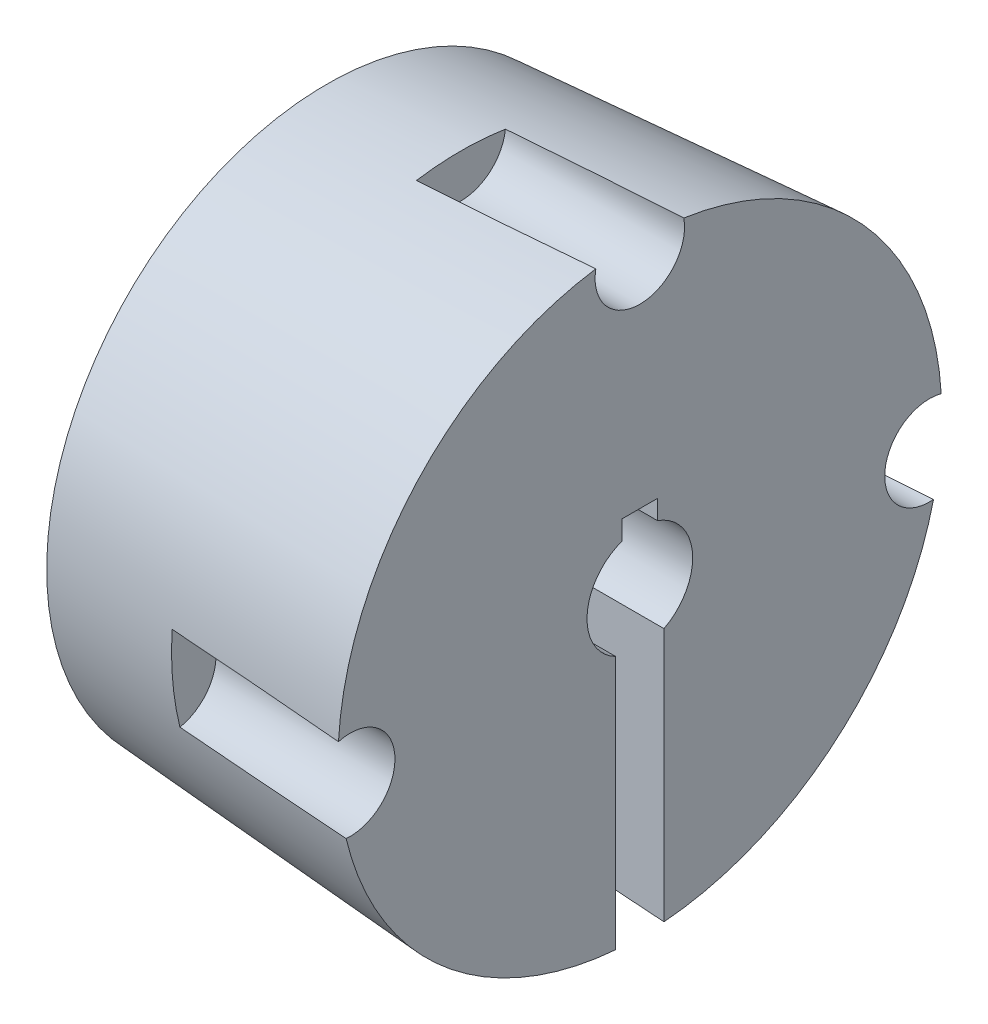
ISO-10303-21;
HEADER;
FILE_DESCRIPTION(('STEP AP214'),'2;1');
FILE_NAME('part.step','',(''),(''),'','','');
FILE_SCHEMA(('AUTOMOTIVE_DESIGN { 1 0 10303 214 1 1 1 1 }'));
ENDSEC;
DATA;
#1=APPLICATION_CONTEXT('core data for automotive mechanical design processes');
#2=APPLICATION_PROTOCOL_DEFINITION('international standard','automotive_design',2000,#1);
#3=PRODUCT_CONTEXT('',#1,'mechanical');
#4=PRODUCT('Part','Part','',(#3));
#5=PRODUCT_RELATED_PRODUCT_CATEGORY('part','',(#4));
#6=PRODUCT_DEFINITION_FORMATION('','',#4);
#7=PRODUCT_DEFINITION_CONTEXT('part definition',#1,'design');
#8=PRODUCT_DEFINITION('design','',#6,#7);
#9=PRODUCT_DEFINITION_SHAPE('','',#8);
#10=(LENGTH_UNIT() NAMED_UNIT(*) SI_UNIT(.MILLI.,.METRE.));
#11=(NAMED_UNIT(*) PLANE_ANGLE_UNIT() SI_UNIT($,.RADIAN.));
#12=(NAMED_UNIT(*) SI_UNIT($,.STERADIAN.) SOLID_ANGLE_UNIT());
#13=UNCERTAINTY_MEASURE_WITH_UNIT(LENGTH_MEASURE(1.E-05),#10,'distance_accuracy_value','');
#14=(GEOMETRIC_REPRESENTATION_CONTEXT(3) GLOBAL_UNCERTAINTY_ASSIGNED_CONTEXT((#13)) GLOBAL_UNIT_ASSIGNED_CONTEXT((#10,
#11,#12)) REPRESENTATION_CONTEXT('',''));
#15=CARTESIAN_POINT('',(0.,0.,0.));
#16=DIRECTION('',(0.,0.,1.));
#17=DIRECTION('',(1.,0.,0.));
#18=AXIS2_PLACEMENT_3D('',#15,#16,#17);
#19=CARTESIAN_POINT('',(44.45,21.43125,0.));
#20=DIRECTION('',(1.,0.,0.));
#21=DIRECTION('',(0.,-1.,0.));
#22=AXIS2_PLACEMENT_3D('',#19,#20,#21);
#23=PLANE('',#22);
#24=DIRECTION('',(0.,1.,0.));
#25=VECTOR('',#24,1.);
#26=CARTESIAN_POINT('',(44.45,-2.143125,3.429));
#27=LINE('',#26,#25);
#28=CARTESIAN_POINT('',(44.45,-42.7251198389191,3.429));
#29=VERTEX_POINT('',#28);
#30=CARTESIAN_POINT('',(44.45,-6.67022930640319,3.429));
#31=VERTEX_POINT('',#30);
#32=EDGE_CURVE('E145',#29,#31,#27,.T.);
#33=ORIENTED_EDGE('',*,*,#32,.T.);
#34=CARTESIAN_POINT('',(44.45,0.,0.));
#35=DIRECTION('',(-1.,0.,0.));
#36=DIRECTION('',(0.,0.,-1.));
#37=AXIS2_PLACEMENT_3D('',#34,#35,#36);
#38=CIRCLE('',#37,7.5);
#39=CARTESIAN_POINT('',(44.45,7.07106781186548,2.5));
#40=VERTEX_POINT('',#39);
#41=EDGE_CURVE('E171',#31,#40,#38,.T.);
#42=ORIENTED_EDGE('',*,*,#41,.T.);
#43=DIRECTION('',(0.,1.,0.));
#44=VECTOR('',#43,1.);
#45=CARTESIAN_POINT('',(44.45,13.165625,2.5));
#46=LINE('',#45,#44);
#47=CARTESIAN_POINT('',(44.45,9.8,2.5));
#48=VERTEX_POINT('',#47);
#49=EDGE_CURVE('E168',#40,#48,#46,.T.);
#50=ORIENTED_EDGE('',*,*,#49,.T.);
#51=DIRECTION('',(0.,0.,-1.));
#52=VECTOR('',#51,1.);
#53=CARTESIAN_POINT('',(44.45,9.8,0.));
#54=LINE('',#53,#52);
#55=CARTESIAN_POINT('',(44.45,9.8,-2.5));
#56=VERTEX_POINT('',#55);
#57=EDGE_CURVE('E11',#48,#56,#54,.T.);
#58=ORIENTED_EDGE('',*,*,#57,.T.);
#59=DIRECTION('',(0.,-1.,0.));
#60=VECTOR('',#59,1.);
#61=CARTESIAN_POINT('',(44.45,13.165625,-2.5));
#62=LINE('',#61,#60);
#63=CARTESIAN_POINT('',(44.45,7.07106781186548,-2.5));
#64=VERTEX_POINT('',#63);
#65=EDGE_CURVE('E166',#56,#64,#62,.T.);
#66=ORIENTED_EDGE('',*,*,#65,.T.);
#67=CARTESIAN_POINT('',(44.45,0.,0.));
#68=DIRECTION('',(-1.,0.,0.));
#69=DIRECTION('',(0.,0.,-1.));
#70=AXIS2_PLACEMENT_3D('',#67,#68,#69);
#71=CIRCLE('',#70,7.5);
#72=CARTESIAN_POINT('',(44.45,-6.67022930640319,-3.429));
#73=VERTEX_POINT('',#72);
#74=EDGE_CURVE('E135',#64,#73,#71,.T.);
#75=ORIENTED_EDGE('',*,*,#74,.T.);
#76=DIRECTION('',(0.,-1.,0.));
#77=VECTOR('',#76,1.);
#78=CARTESIAN_POINT('',(44.45,-2.143125,-3.429));
#79=LINE('',#78,#77);
#80=CARTESIAN_POINT('',(44.45,-42.7251198389191,-3.429));
#81=VERTEX_POINT('',#80);
#82=EDGE_CURVE('E132',#73,#81,#79,.T.);
#83=ORIENTED_EDGE('',*,*,#82,.T.);
#84=CARTESIAN_POINT('',(44.45,0.,0.));
#85=DIRECTION('',(-1.,0.,0.));
#86=DIRECTION('',(0.,1.,0.));
#87=AXIS2_PLACEMENT_3D('',#84,#85,#86);
#88=CIRCLE('',#87,42.8625);
#89=CARTESIAN_POINT('',(44.45,-9.92074935625879,-41.6985927635489));
#90=VERTEX_POINT('',#89);
#91=EDGE_CURVE('E117',#90,#81,#88,.T.);
#92=ORIENTED_EDGE('',*,*,#91,.F.);
#93=CARTESIAN_POINT('',(44.45,-3.59735328190959,-41.1179361637368));
#94=DIRECTION('',(-1.,0.,0.));
#95=DIRECTION('',(0.,-0.996194698091746,0.0871557427476582));
#96=AXIS2_PLACEMENT_3D('',#93,#94,#95);
#97=CIRCLE('',#96,6.35);
#98=CARTESIAN_POINT('',(44.45,2.52914623706881,-42.7878174900464));
#99=VERTEX_POINT('',#98);
#100=EDGE_CURVE('E220',#90,#99,#97,.T.);
#101=ORIENTED_EDGE('',*,*,#100,.T.);
#102=CARTESIAN_POINT('',(44.45,0.,0.));
#103=DIRECTION('',(-1.,0.,0.));
#104=DIRECTION('',(0.,1.,0.));
#105=AXIS2_PLACEMENT_3D('',#102,#103,#104);
#106=CIRCLE('',#105,42.8625);
#107=CARTESIAN_POINT('',(44.45,42.4045673076923,-6.24872608596287));
#108=VERTEX_POINT('',#107);
#109=EDGE_CURVE('E129',#108,#99,#106,.T.);
#110=ORIENTED_EDGE('',*,*,#109,.F.);
#111=CARTESIAN_POINT('',(44.45,41.275,0.));
#112=DIRECTION('',(-1.,0.,0.));
#113=DIRECTION('',(0.,0.,-1.));
#114=AXIS2_PLACEMENT_3D('',#111,#112,#113);
#115=CIRCLE('',#114,6.35);
#116=CARTESIAN_POINT('',(44.45,42.4045673076923,6.24872608596287));
#117=VERTEX_POINT('',#116);
#118=EDGE_CURVE('E175',#108,#117,#115,.T.);
#119=ORIENTED_EDGE('',*,*,#118,.T.);
#120=CARTESIAN_POINT('',(44.45,0.,0.));
#121=DIRECTION('',(-1.,0.,0.));
#122=DIRECTION('',(0.,1.,0.));
#123=AXIS2_PLACEMENT_3D('',#120,#121,#122);
#124=CIRCLE('',#123,42.8625);
#125=CARTESIAN_POINT('',(44.45,2.52914623706881,42.7878174900464));
#126=VERTEX_POINT('',#125);
#127=EDGE_CURVE('E181',#126,#117,#124,.T.);
#128=ORIENTED_EDGE('',*,*,#127,.F.);
#129=CARTESIAN_POINT('',(44.45,-3.59735328190959,41.1179361637368));
#130=DIRECTION('',(-1.,0.,0.));
#131=DIRECTION('',(0.,0.996194698091746,0.0871557427476582));
#132=AXIS2_PLACEMENT_3D('',#129,#130,#131);
#133=CIRCLE('',#132,6.35);
#134=CARTESIAN_POINT('',(44.45,-9.92074935625879,41.6985927635489));
#135=VERTEX_POINT('',#134);
#136=EDGE_CURVE('E193',#126,#135,#133,.T.);
#137=ORIENTED_EDGE('',*,*,#136,.T.);
#138=CARTESIAN_POINT('',(44.45,0.,0.));
#139=DIRECTION('',(-1.,0.,0.));
#140=DIRECTION('',(0.,1.,0.));
#141=AXIS2_PLACEMENT_3D('',#138,#139,#140);
#142=CIRCLE('',#141,42.8625);
#143=EDGE_CURVE('E204',#29,#135,#142,.T.);
#144=ORIENTED_EDGE('',*,*,#143,.F.);
#145=EDGE_LOOP('',(#33,#42,#50,#58,#66,#75,#83,#92,#101,#110,#119,#128,#137,#144));
#146=FACE_BOUND('',#145,.T.);
#147=ADVANCED_FACE('F19',(#146),#23,.T.);
#148=CARTESIAN_POINT('',(22.225,9.8,0.));
#149=DIRECTION('',(0.,-1.,0.));
#150=DIRECTION('',(0.,0.,-1.));
#151=AXIS2_PLACEMENT_3D('',#148,#149,#150);
#152=PLANE('',#151);
#153=DIRECTION('',(0.,0.,1.));
#154=VECTOR('',#153,1.);
#155=CARTESIAN_POINT('',(0.,9.8,0.));
#156=LINE('',#155,#154);
#157=CARTESIAN_POINT('',(0.,9.8,-2.5));
#158=VERTEX_POINT('',#157);
#159=CARTESIAN_POINT('',(0.,9.8,2.5));
#160=VERTEX_POINT('',#159);
#161=EDGE_CURVE('E164',#158,#160,#156,.T.);
#162=ORIENTED_EDGE('',*,*,#161,.F.);
#163=DIRECTION('',(1.,0.,0.));
#164=VECTOR('',#163,1.);
#165=CARTESIAN_POINT('',(22.225,9.8,-2.5));
#166=LINE('',#165,#164);
#167=EDGE_CURVE('E31',#158,#56,#166,.T.);
#168=ORIENTED_EDGE('',*,*,#167,.T.);
#169=ORIENTED_EDGE('',*,*,#57,.F.);
#170=DIRECTION('',(-1.,0.,0.));
#171=VECTOR('',#170,1.);
#172=CARTESIAN_POINT('',(22.225,9.8,2.5));
#173=LINE('',#172,#171);
#174=EDGE_CURVE('E177',#48,#160,#173,.T.);
#175=ORIENTED_EDGE('',*,*,#174,.T.);
#176=EDGE_LOOP('',(#162,#168,#169,#175));
#177=FACE_BOUND('',#176,.T.);
#178=ADVANCED_FACE('F311',(#177),#152,.T.);
#179=CARTESIAN_POINT('',(22.225,4.9,-2.5));
#180=DIRECTION('',(0.,0.,1.));
#181=DIRECTION('',(1.,0.,0.));
#182=AXIS2_PLACEMENT_3D('',#179,#180,#181);
#183=PLANE('',#182);
#184=DIRECTION('',(0.,1.,0.));
#185=VECTOR('',#184,1.);
#186=CARTESIAN_POINT('',(0.,12.3898261474885,-2.5));
#187=LINE('',#186,#185);
#188=CARTESIAN_POINT('',(0.,7.07106781186548,-2.5));
#189=VERTEX_POINT('',#188);
#190=EDGE_CURVE('E174',#189,#158,#187,.T.);
#191=ORIENTED_EDGE('',*,*,#190,.F.);
#192=DIRECTION('',(-1.,0.,0.));
#193=VECTOR('',#192,1.);
#194=CARTESIAN_POINT('',(22.225,7.07106781186548,-2.5));
#195=LINE('',#194,#193);
#196=EDGE_CURVE('E155',#64,#189,#195,.T.);
#197=ORIENTED_EDGE('',*,*,#196,.F.);
#198=ORIENTED_EDGE('',*,*,#65,.F.);
#199=ORIENTED_EDGE('',*,*,#167,.F.);
#200=EDGE_LOOP('',(#191,#197,#198,#199));
#201=FACE_BOUND('',#200,.T.);
#202=ADVANCED_FACE('F309',(#201),#183,.T.);
#203=CARTESIAN_POINT('',(22.225,4.9,2.5));
#204=DIRECTION('',(0.,0.,1.));
#205=DIRECTION('',(1.,0.,0.));
#206=AXIS2_PLACEMENT_3D('',#203,#204,#205);
#207=PLANE('',#206);
#208=DIRECTION('',(0.,-1.,0.));
#209=VECTOR('',#208,1.);
#210=CARTESIAN_POINT('',(0.,12.3898261474885,2.5));
#211=LINE('',#210,#209);
#212=CARTESIAN_POINT('',(0.,7.07106781186548,2.5));
#213=VERTEX_POINT('',#212);
#214=EDGE_CURVE('E161',#160,#213,#211,.T.);
#215=ORIENTED_EDGE('',*,*,#214,.F.);
#216=ORIENTED_EDGE('',*,*,#174,.F.);
#217=ORIENTED_EDGE('',*,*,#49,.F.);
#218=DIRECTION('',(1.,0.,0.));
#219=VECTOR('',#218,1.);
#220=CARTESIAN_POINT('',(22.225,7.07106781186548,2.5));
#221=LINE('',#220,#219);
#222=EDGE_CURVE('E160',#213,#40,#221,.T.);
#223=ORIENTED_EDGE('',*,*,#222,.F.);
#224=EDGE_LOOP('',(#215,#216,#217,#223));
#225=FACE_BOUND('',#224,.T.);
#226=ADVANCED_FACE('F306',(#225),#207,.F.);
#227=CARTESIAN_POINT('',(32.25,41.275,0.));
#228=DIRECTION('',(-1.,0.,0.));
#229=DIRECTION('',(0.,0.,-1.));
#230=AXIS2_PLACEMENT_3D('',#227,#228,#229);
#231=CYLINDRICAL_SURFACE('',#230,6.35);
#232=CARTESIAN_POINT('',(44.4499994377605,42.4045707751449,6.24870228614474));
#233=CARTESIAN_POINT('',(43.3968772363578,42.3282276338168,6.26245814853408));
#234=CARTESIAN_POINT('',(42.3437226003836,42.2520739228383,6.27477039432463));
#235=CARTESIAN_POINT('',(40.2359334055662,42.1000478170982,6.29657493333557));
#236=CARTESIAN_POINT('',(39.1812987696076,42.0241759414053,6.30606339424084));
#237=CARTESIAN_POINT('',(37.0705496273191,41.87271962596,6.32226173233247));
#238=CARTESIAN_POINT('',(36.0144350540272,41.7971357156746,6.32896782320019));
#239=CARTESIAN_POINT('',(33.9007260094879,41.6462593299077,6.33964257163051));
#240=CARTESIAN_POINT('',(32.843131481084,41.5709673913316,6.34360748970003));
#241=CARTESIAN_POINT('',(30.7264625218382,41.4206774719164,6.34884096730903));
#242=CARTESIAN_POINT('',(29.6673880434314,41.3456800333124,6.35010583515522));
#243=CARTESIAN_POINT('',(27.5477591689462,41.1959800023421,6.34998015915306));
#244=CARTESIAN_POINT('',(26.4872047346296,41.1212779551954,6.34858597226661));
#245=CARTESIAN_POINT('',(24.3646159544568,40.9721681737217,6.34318305670457));
#246=CARTESIAN_POINT('',(23.3025815794635,40.8977609855277,6.33917073452475));
#247=CARTESIAN_POINT('',(21.1770328507258,40.7492384984032,6.3285721833212));
#248=CARTESIAN_POINT('',(20.1135184765855,40.6751237437879,6.32198241094245));
#249=CARTESIAN_POINT('',(19.0499999356797,40.6012048561771,6.31413160864357));
#250=B_SPLINE_CURVE_WITH_KNOTS('',3,(#232,#233,#234,#235,#236,#237,#238,#239,#240,#241,#242,
#243,#244,#245,#246,#247,#248,#249),.UNSPECIFIED.,.F.,.F.,(4,2,2,2,2,2,2,2,4),(0.,
3.16792472189612,6.34012940656053,9.51663685904563,12.6974691802353,15.8826477746161,
19.0721933580867,22.2661259658029,25.4644649600553),.UNSPECIFIED.);
#251=CARTESIAN_POINT('',(19.05,40.6012019274809,6.31415046997373));
#252=VERTEX_POINT('',#251);
#253=EDGE_CURVE('E184',#117,#252,#250,.T.);
#254=ORIENTED_EDGE('',*,*,#253,.F.);
#255=ORIENTED_EDGE('',*,*,#118,.F.);
#256=CARTESIAN_POINT('',(19.0499999356797,40.6012048561771,-6.31413160864345));
#257=CARTESIAN_POINT('',(20.1135184765855,40.6751237437879,-6.32198241094234));
#258=CARTESIAN_POINT('',(21.1770328507259,40.7492384984033,-6.32857218332111));
#259=CARTESIAN_POINT('',(23.3025815794636,40.8977609855277,-6.33917073452468));
#260=CARTESIAN_POINT('',(24.3646159544569,40.9721681737217,-6.34318305670451));
#261=CARTESIAN_POINT('',(26.4872047346297,41.1212779551954,-6.34858597226657));
#262=CARTESIAN_POINT('',(27.5477591689464,41.1959800023421,-6.34998015915304));
#263=CARTESIAN_POINT('',(29.6673880434315,41.3456800333125,-6.3501058351552));
#264=CARTESIAN_POINT('',(30.7264625218384,41.4206774719165,-6.34884096730901));
#265=CARTESIAN_POINT('',(32.8431314810842,41.5709673913316,-6.34360748970002));
#266=CARTESIAN_POINT('',(33.9007260094881,41.6462593299077,-6.33964257163052));
#267=CARTESIAN_POINT('',(36.0144350540273,41.7971357156746,-6.3289678232002));
#268=CARTESIAN_POINT('',(37.0705496273192,41.87271962596,-6.32226173233247));
#269=CARTESIAN_POINT('',(39.1812987696077,42.0241759414053,-6.30606339424085));
#270=CARTESIAN_POINT('',(40.2359334055663,42.1000478170982,-6.2965749333356));
#271=CARTESIAN_POINT('',(42.3437226003836,42.2520739228383,-6.27477039432468));
#272=CARTESIAN_POINT('',(43.3968772363578,42.3282276338168,-6.26245814853414));
#273=CARTESIAN_POINT('',(44.4499994377605,42.4045707751449,-6.24870228614477));
#274=B_SPLINE_CURVE_WITH_KNOTS('',3,(#256,#257,#258,#259,#260,#261,#262,#263,#264,#265,#266,
#267,#268,#269,#270,#271,#272,#273),.UNSPECIFIED.,.F.,.F.,(4,2,2,2,2,2,2,2,4),(0.,
3.19833899425247,6.39227160196867,9.58181718543935,12.7669957798202,15.9478281010098,
19.1243355534949,22.2965402381592,25.4644649600553),.UNSPECIFIED.);
#275=CARTESIAN_POINT('',(19.05,40.6012019274809,-6.31415046997373));
#276=VERTEX_POINT('',#275);
#277=EDGE_CURVE('E189',#276,#108,#274,.T.);
#278=ORIENTED_EDGE('',*,*,#277,.F.);
#279=CARTESIAN_POINT('',(19.05,41.275,0.));
#280=DIRECTION('',(-1.,0.,0.));
#281=DIRECTION('',(0.,0.,-1.));
#282=AXIS2_PLACEMENT_3D('',#279,#280,#281);
#283=CIRCLE('',#282,6.35);
#284=EDGE_CURVE('E178',#276,#252,#283,.T.);
#285=ORIENTED_EDGE('',*,*,#284,.T.);
#286=EDGE_LOOP('',(#254,#255,#278,#285));
#287=FACE_BOUND('',#286,.T.);
#288=ADVANCED_FACE('F308',(#287),#231,.F.);
#289=CARTESIAN_POINT('',(19.05,41.275,0.));
#290=DIRECTION('',(-1.,0.,0.));
#291=DIRECTION('',(0.,0.,1.));
#292=AXIS2_PLACEMENT_3D('',#289,#290,#291);
#293=PLANE('',#292);
#294=CARTESIAN_POINT('',(19.05,0.,0.));
#295=DIRECTION('',(-1.,0.,0.));
#296=DIRECTION('',(0.,1.,0.));
#297=AXIS2_PLACEMENT_3D('',#294,#295,#296);
#298=CIRCLE('',#297,41.0892454799738);
#299=EDGE_CURVE('E196',#252,#276,#298,.T.);
#300=ORIENTED_EDGE('',*,*,#299,.F.);
#301=ORIENTED_EDGE('',*,*,#284,.F.);
#302=EDGE_LOOP('',(#300,#301));
#303=FACE_BOUND('',#302,.T.);
#304=ADVANCED_FACE('F245',(#303),#293,.F.);
#305=CARTESIAN_POINT('',(32.25,-3.59735328190959,41.1179361637368));
#306=DIRECTION('',(-1.,0.,0.));
#307=DIRECTION('',(0.,0.996194698091746,0.0871557427476582));
#308=AXIS2_PLACEMENT_3D('',#305,#306,#307);
#309=CYLINDRICAL_SURFACE('',#308,6.35);
#310=CARTESIAN_POINT('',(44.4499994373455,-9.92072593192531,41.6985982961812));
#311=CARTESIAN_POINT('',(43.396876577148,-9.92777569717745,41.621346715967));
#312=CARTESIAN_POINT('',(42.3437212824389,-9.93340385104634,41.5444096642893));
#313=CARTESIAN_POINT('',(40.235930958359,-9.94187545690467,41.3910615948311));
#314=CARTESIAN_POINT('',(39.1812958518832,-9.94471513690661,41.3146514280387));
#315=CARTESIAN_POINT('',(37.0705459567665,-9.94765153991716,41.1623596192388));
#316=CARTESIAN_POINT('',(36.0144311011725,-9.94774453765601,41.0864788345693));
#317=CARTESIAN_POINT('',(33.9007216802376,-9.94522891857416,40.9352461871537));
#318=CARTESIAN_POINT('',(32.8431270577475,-9.94261662376948,40.8598951850747));
#319=CARTESIAN_POINT('',(30.726458098539,-9.93473155802947,40.7097210362591));
#320=CARTESIAN_POINT('',(29.6673837142618,-9.92945515718274,40.6348987513336));
#321=CARTESIAN_POINT('',(27.5477552162469,-9.91628274787218,40.485779353183));
#322=CARTESIAN_POINT('',(26.4872010642758,-9.90838315821735,40.4114831005028));
#323=CARTESIAN_POINT('',(24.364613037006,-9.89000503922054,40.2634116734014));
#324=CARTESIAN_POINT('',(23.3025791325738,-9.87952297810284,40.1896373561188));
#325=CARTESIAN_POINT('',(21.1770315331732,-9.856020185306,40.0426038439033));
#326=CARTESIAN_POINT('',(20.1135178178115,-9.8429959716415,39.9693454999289));
#327=CARTESIAN_POINT('',(19.0499999356798,-9.8287325972978,39.8963921836968));
#328=B_SPLINE_CURVE_WITH_KNOTS('',3,(#310,#311,#312,#313,#314,#315,#316,#317,#318,#319,#320,
#321,#322,#323,#324,#325,#326,#327),.UNSPECIFIED.,.F.,.F.,(4,2,2,2,2,2,2,2,4),(0.,
3.16792670269164,6.34013280225914,9.51664110370384,12.6974737078695,15.8826520192134,
19.0721967536152,22.2661279462216,25.4644649593242),.UNSPECIFIED.);
#329=CARTESIAN_POINT('',(19.05,-9.82875113157858,39.8963876222778));
#330=VERTEX_POINT('',#329);
#331=EDGE_CURVE('E207',#135,#330,#328,.T.);
#332=ORIENTED_EDGE('',*,*,#331,.F.);
#333=ORIENTED_EDGE('',*,*,#136,.F.);
#334=CARTESIAN_POINT('',(19.0499999356798,2.75147626591841,40.9970178440166));
#335=CARTESIAN_POINT('',(20.1135178178116,2.75285473713774,41.0713396444121));
#336=CARTESIAN_POINT('',(21.1770315331733,2.75295990580141,41.1457466604993));
#337=CARTESIAN_POINT('',(23.3025791325739,2.75057353691303,41.294627620421));
#338=CARTESIAN_POINT('',(24.3646130370062,2.74808557621457,41.3691013308653));
#339=CARTESIAN_POINT('',(26.4872010642761,2.74047215680772,41.5181145471472));
#340=CARTESIAN_POINT('',(27.5477552162472,2.73535032506001,41.5926538221543));
#341=CARTESIAN_POINT('',(29.6673837142621,2.72242830413128,41.7417951264497));
#342=CARTESIAN_POINT('',(30.7264580985393,2.71463179116697,41.8163969301341));
#343=CARTESIAN_POINT('',(32.8431270577478,2.69631959776625,41.9656588234863));
#344=CARTESIAN_POINT('',(33.9007216802379,2.68580764174667,42.0403186947633));
#345=CARTESIAN_POINT('',(36.0144311011728,2.66202376929464,42.189690611116));
#346=CARTESIAN_POINT('',(37.0705459567667,2.64875562442263,42.2644024472753));
#347=CARTESIAN_POINT('',(39.1812958518834,2.61941863690019,42.41387070027));
#348=CARTESIAN_POINT('',(40.2359309583591,2.60335361179947,42.4886269196786));
#349=CARTESIAN_POINT('',(42.343721282439,2.56838209585958,42.6381742084712));
#350=CARTESIAN_POINT('',(43.3968765771481,2.54947946747544,42.7129650947944));
#351=CARTESIAN_POINT('',(44.4499994373455,2.52912220787212,42.7878188710328));
#352=B_SPLINE_CURVE_WITH_KNOTS('',3,(#334,#335,#336,#337,#338,#339,#340,#341,#342,#343,#344,
#345,#346,#347,#348,#349,#350,#351),.UNSPECIFIED.,.F.,.F.,(4,2,2,2,2,2,2,2,4),(0.,
3.19833701310272,6.39226820570924,9.58181294011108,12.766991251455,15.9478238556206,
19.1243321570653,22.2965382566327,25.4644649593242),.UNSPECIFIED.);
#353=CARTESIAN_POINT('',(19.05,2.75149531070409,40.9970165703398));
#354=VERTEX_POINT('',#353);
#355=EDGE_CURVE('E185',#354,#126,#352,.T.);
#356=ORIENTED_EDGE('',*,*,#355,.F.);
#357=CARTESIAN_POINT('',(19.05,-3.59735328190959,41.1179361637368));
#358=DIRECTION('',(-1.,0.,0.));
#359=DIRECTION('',(0.,0.996194698091746,0.0871557427476582));
#360=AXIS2_PLACEMENT_3D('',#357,#358,#359);
#361=CIRCLE('',#360,6.35);
#362=EDGE_CURVE('E128',#354,#330,#361,.T.);
#363=ORIENTED_EDGE('',*,*,#362,.T.);
#364=EDGE_LOOP('',(#332,#333,#356,#363));
#365=FACE_BOUND('',#364,.T.);
#366=ADVANCED_FACE('F302',(#365),#309,.F.);
#367=CARTESIAN_POINT('',(19.05,-3.59735328190959,41.1179361637368));
#368=DIRECTION('',(-1.,0.,0.));
#369=DIRECTION('',(0.,-0.996194698091746,-0.0871557427476582));
#370=AXIS2_PLACEMENT_3D('',#367,#368,#369);
#371=PLANE('',#370);
#372=CARTESIAN_POINT('',(19.05,0.,0.));
#373=DIRECTION('',(-1.,0.,0.));
#374=DIRECTION('',(0.,1.,0.));
#375=AXIS2_PLACEMENT_3D('',#372,#373,#374);
#376=CIRCLE('',#375,41.0892454799738);
#377=EDGE_CURVE('E213',#330,#354,#376,.T.);
#378=ORIENTED_EDGE('',*,*,#377,.F.);
#379=ORIENTED_EDGE('',*,*,#362,.F.);
#380=EDGE_LOOP('',(#378,#379));
#381=FACE_BOUND('',#380,.T.);
#382=ADVANCED_FACE('F243',(#381),#371,.F.);
#383=CARTESIAN_POINT('',(22.225,0.,0.));
#384=DIRECTION('',(1.,0.,0.));
#385=DIRECTION('',(0.,1.,0.));
#386=AXIS2_PLACEMENT_3D('',#383,#384,#385);
#387=CONICAL_SURFACE('',#386,41.310902294977,0.0697000802996132);
#388=CARTESIAN_POINT('',(0.,-39.6111633315249,3.429));
#389=CARTESIAN_POINT('',(21.3846333388885,-41.1096757612967,3.429));
#390=CARTESIAN_POINT('',(44.4504036965975,-42.7251481128802,3.429));
#391=(BOUNDED_CURVE() B_SPLINE_CURVE(2,(#388,#389,#390),.UNSPECIFIED.,.F.,
.F.) B_SPLINE_CURVE_WITH_KNOTS((3,3),(0.,44.559345710787),
.UNSPECIFIED.) CURVE() GEOMETRIC_REPRESENTATION_ITEM() RATIONAL_B_SPLINE_CURVE((1.,
1.00071102629083,1.)) REPRESENTATION_ITEM(''));
#392=CARTESIAN_POINT('',(0.,-39.6111633315249,3.429));
#393=VERTEX_POINT('',#392);
#394=EDGE_CURVE('E336',#393,#29,#391,.T.);
#395=ORIENTED_EDGE('',*,*,#394,.T.);
#396=ORIENTED_EDGE('',*,*,#143,.T.);
#397=ORIENTED_EDGE('',*,*,#331,.T.);
#398=ORIENTED_EDGE('',*,*,#377,.T.);
#399=ORIENTED_EDGE('',*,*,#355,.T.);
#400=ORIENTED_EDGE('',*,*,#127,.T.);
#401=ORIENTED_EDGE('',*,*,#253,.T.);
#402=ORIENTED_EDGE('',*,*,#299,.T.);
#403=ORIENTED_EDGE('',*,*,#277,.T.);
#404=ORIENTED_EDGE('',*,*,#109,.T.);
#405=CARTESIAN_POINT('',(44.4499994373455,2.52912220787183,-42.7878188710328));
#406=CARTESIAN_POINT('',(43.3968765771327,2.54947946747516,-42.7129650947934));
#407=CARTESIAN_POINT('',(42.3437212824083,2.56838209585931,-42.6381742084691));
#408=CARTESIAN_POINT('',(40.2359309583021,2.60335361179921,-42.4886269196746));
#409=CARTESIAN_POINT('',(39.1812958518154,2.61941863689993,-42.4138707002652));
#410=CARTESIAN_POINT('',(37.0705459566811,2.64875562442238,-42.2644024472693));
#411=CARTESIAN_POINT('',(36.0144311010806,2.66202376929443,-42.1896906111096));
#412=CARTESIAN_POINT('',(33.9007216801369,2.6858076417465,-42.0403186947562));
#413=CARTESIAN_POINT('',(32.8431270576446,2.6963195977661,-41.9656588234791));
#414=CARTESIAN_POINT('',(30.7264580984362,2.71463179116682,-41.8163969301269));
#415=CARTESIAN_POINT('',(29.6673837141611,2.72242830413112,-41.7417951264426));
#416=CARTESIAN_POINT('',(27.547755216155,2.73535032505985,-41.5926538221478));
#417=CARTESIAN_POINT('',(26.4872010641905,2.7404721568076,-41.5181145471412));
#418=CARTESIAN_POINT('',(24.3646130369382,2.74808557621448,-41.3691013308606));
#419=CARTESIAN_POINT('',(23.3025791325169,2.75057353691295,-41.294627620417));
#420=CARTESIAN_POINT('',(21.1770315331425,2.75295990580133,-41.1457466604971));
#421=CARTESIAN_POINT('',(20.1135178177962,2.75285473713768,-41.071339644411));
#422=CARTESIAN_POINT('',(19.0499999356797,2.75147626591837,-40.9970178440166));
#423=B_SPLINE_CURVE_WITH_KNOTS('',3,(#405,#406,#407,#408,#409,#410,#411,#412,#413,#414,#415,
#416,#417,#418,#419,#420,#421,#422),.UNSPECIFIED.,.F.,.F.,(4,2,2,2,2,2,2,2,4),(0.,
3.16792670273772,6.34013280233815,9.51664110380259,12.6974737079749,15.8826520193122,
19.0721967536942,22.2661279462677,25.4644649593242),.UNSPECIFIED.);
#424=CARTESIAN_POINT('',(19.05,2.75149531070409,-40.9970165703398));
#425=VERTEX_POINT('',#424);
#426=EDGE_CURVE('E222',#99,#425,#423,.T.);
#427=ORIENTED_EDGE('',*,*,#426,.T.);
#428=CARTESIAN_POINT('',(19.05,0.,0.));
#429=DIRECTION('',(-1.,0.,0.));
#430=DIRECTION('',(0.,1.,0.));
#431=AXIS2_PLACEMENT_3D('',#428,#429,#430);
#432=CIRCLE('',#431,41.0892454799738);
#433=CARTESIAN_POINT('',(19.05,-9.82875113157858,-39.8963876222778));
#434=VERTEX_POINT('',#433);
#435=EDGE_CURVE('E347',#425,#434,#432,.T.);
#436=ORIENTED_EDGE('',*,*,#435,.T.);
#437=CARTESIAN_POINT('',(19.0499999356798,-9.82873259729765,-39.8963921836969));
#438=CARTESIAN_POINT('',(20.1135178177962,-9.84299597164117,-39.9693454999279));
#439=CARTESIAN_POINT('',(21.1770315331424,-9.85602018530548,-40.0426038439012));
#440=CARTESIAN_POINT('',(23.3025791325167,-9.879522978102,-40.1896373561149));
#441=CARTESIAN_POINT('',(24.364613036938,-9.89000503921956,-40.2634116733967));
#442=CARTESIAN_POINT('',(26.4872010641902,-9.90838315821616,-40.411483100497));
#443=CARTESIAN_POINT('',(27.5477552161547,-9.91628274787091,-40.4857793531767));
#444=CARTESIAN_POINT('',(29.6673837141608,-9.92945515718135,-40.6348987513267));
#445=CARTESIAN_POINT('',(30.7264580984358,-9.93473155802804,-40.709721036252));
#446=CARTESIAN_POINT('',(32.8431270576443,-9.94261662376804,-40.8598951850677));
#447=CARTESIAN_POINT('',(33.9007216801366,-9.94522891857275,-40.9352461871468));
#448=CARTESIAN_POINT('',(36.0144311010803,-9.94774453765468,-41.086478834563));
#449=CARTESIAN_POINT('',(37.0705459566808,-9.94765153991587,-41.162359619233));
#450=CARTESIAN_POINT('',(39.1812958518151,-9.9447151369055,-41.314651428034));
#451=CARTESIAN_POINT('',(40.2359309583019,-9.94187545690368,-41.3910615948272));
#452=CARTESIAN_POINT('',(42.3437212824081,-9.93340385104565,-41.5444096642872));
#453=CARTESIAN_POINT('',(43.3968765771326,-9.92777569717692,-41.621346715966));
#454=CARTESIAN_POINT('',(44.4499994373455,-9.92072593192494,-41.6985982961813));
#455=B_SPLINE_CURVE_WITH_KNOTS('',3,(#437,#438,#439,#440,#441,#442,#443,#444,#445,#446,#447,
#448,#449,#450,#451,#452,#453,#454),.UNSPECIFIED.,.F.,.F.,(4,2,2,2,2,2,2,2,4),(0.,
3.19833701305637,6.39226820562978,9.58181294001175,12.766991251349,15.9478238555213,
19.1243321569858,22.2965382565863,25.4644649593241),.UNSPECIFIED.);
#456=EDGE_CURVE('E124',#434,#90,#455,.T.);
#457=ORIENTED_EDGE('',*,*,#456,.T.);
#458=ORIENTED_EDGE('',*,*,#91,.T.);
#459=CARTESIAN_POINT('',(44.4504036965975,-42.7251481128802,-3.429));
#460=CARTESIAN_POINT('',(21.3846333388885,-41.1096757612967,-3.429));
#461=CARTESIAN_POINT('',(0.,-39.6111633315249,-3.429));
#462=(BOUNDED_CURVE() B_SPLINE_CURVE(2,(#459,#460,#461),.UNSPECIFIED.,.F.,
.F.) B_SPLINE_CURVE_WITH_KNOTS((3,3),(0.,44.559345710787),
.UNSPECIFIED.) CURVE() GEOMETRIC_REPRESENTATION_ITEM() RATIONAL_B_SPLINE_CURVE((1.,
1.00071102629492,1.)) REPRESENTATION_ITEM(''));
#463=CARTESIAN_POINT('',(0.,-39.6111633315249,-3.429));
#464=VERTEX_POINT('',#463);
#465=EDGE_CURVE('E122',#81,#464,#462,.T.);
#466=ORIENTED_EDGE('',*,*,#465,.T.);
#467=CARTESIAN_POINT('',(0.,0.,0.));
#468=DIRECTION('',(-1.,0.,0.));
#469=DIRECTION('',(0.,1.,0.));
#470=AXIS2_PLACEMENT_3D('',#467,#468,#469);
#471=CIRCLE('',#470,39.7593045899541);
#472=EDGE_CURVE('E330',#393,#464,#471,.T.);
#473=ORIENTED_EDGE('',*,*,#472,.F.);
#474=EDGE_LOOP('',(#395,#396,#397,#398,#399,#400,#401,#402,#403,#404,#427,#436,#457,#458,#466,#473));
#475=FACE_BOUND('',#474,.T.);
#476=ADVANCED_FACE('F120',(#475),#387,.T.);
#477=CARTESIAN_POINT('',(32.25,-3.59735328190959,-41.1179361637368));
#478=DIRECTION('',(-1.,0.,0.));
#479=DIRECTION('',(0.,-0.996194698091746,0.0871557427476582));
#480=AXIS2_PLACEMENT_3D('',#477,#478,#479);
#481=CYLINDRICAL_SURFACE('',#480,6.35);
#482=ORIENTED_EDGE('',*,*,#426,.F.);
#483=ORIENTED_EDGE('',*,*,#100,.F.);
#484=ORIENTED_EDGE('',*,*,#456,.F.);
#485=CARTESIAN_POINT('',(19.05,-3.59735328190959,-41.1179361637368));
#486=DIRECTION('',(-1.,0.,0.));
#487=DIRECTION('',(0.,-0.996194698091746,0.0871557427476582));
#488=AXIS2_PLACEMENT_3D('',#485,#486,#487);
#489=CIRCLE('',#488,6.35);
#490=EDGE_CURVE('E370',#434,#425,#489,.T.);
#491=ORIENTED_EDGE('',*,*,#490,.T.);
#492=EDGE_LOOP('',(#482,#483,#484,#491));
#493=FACE_BOUND('',#492,.T.);
#494=ADVANCED_FACE('F242',(#493),#481,.F.);
#495=CARTESIAN_POINT('',(19.05,-3.59735328190959,-41.1179361637368));
#496=DIRECTION('',(-1.,0.,0.));
#497=DIRECTION('',(0.,0.996194698091746,-0.0871557427476582));
#498=AXIS2_PLACEMENT_3D('',#495,#496,#497);
#499=PLANE('',#498);
#500=ORIENTED_EDGE('',*,*,#435,.F.);
#501=ORIENTED_EDGE('',*,*,#490,.F.);
#502=EDGE_LOOP('',(#500,#501));
#503=FACE_BOUND('',#502,.T.);
#504=ADVANCED_FACE('F293',(#503),#499,.F.);
#505=CARTESIAN_POINT('',(22.225,0.,0.));
#506=DIRECTION('',(-1.,0.,0.));
#507=DIRECTION('',(0.,0.,-1.));
#508=AXIS2_PLACEMENT_3D('',#505,#506,#507);
#509=CYLINDRICAL_SURFACE('',#508,7.5);
#510=DIRECTION('',(-1.,0.,0.));
#511=VECTOR('',#510,1.);
#512=CARTESIAN_POINT('',(22.225,-6.67022930640319,3.429));
#513=LINE('',#512,#511);
#514=CARTESIAN_POINT('',(0.,-6.67022930640319,3.429));
#515=VERTEX_POINT('',#514);
#516=EDGE_CURVE('E147',#31,#515,#513,.T.);
#517=ORIENTED_EDGE('',*,*,#516,.T.);
#518=CARTESIAN_POINT('',(0.,0.,0.));
#519=DIRECTION('',(1.,0.,0.));
#520=DIRECTION('',(0.,0.,-1.));
#521=AXIS2_PLACEMENT_3D('',#518,#519,#520);
#522=CIRCLE('',#521,7.5);
#523=EDGE_CURVE('E153',#213,#515,#522,.T.);
#524=ORIENTED_EDGE('',*,*,#523,.F.);
#525=ORIENTED_EDGE('',*,*,#222,.T.);
#526=ORIENTED_EDGE('',*,*,#41,.F.);
#527=EDGE_LOOP('',(#517,#524,#525,#526));
#528=FACE_BOUND('',#527,.T.);
#529=ADVANCED_FACE('F481',(#528),#509,.F.);
#530=CARTESIAN_POINT('',(22.225,0.,0.));
#531=DIRECTION('',(-1.,0.,0.));
#532=DIRECTION('',(0.,0.,-1.));
#533=AXIS2_PLACEMENT_3D('',#530,#531,#532);
#534=CYLINDRICAL_SURFACE('',#533,7.5);
#535=DIRECTION('',(1.,0.,0.));
#536=VECTOR('',#535,1.);
#537=CARTESIAN_POINT('',(22.225,-6.67022930640319,-3.429));
#538=LINE('',#537,#536);
#539=CARTESIAN_POINT('',(0.,-6.67022930640319,-3.429));
#540=VERTEX_POINT('',#539);
#541=EDGE_CURVE('E139',#540,#73,#538,.T.);
#542=ORIENTED_EDGE('',*,*,#541,.T.);
#543=ORIENTED_EDGE('',*,*,#74,.F.);
#544=ORIENTED_EDGE('',*,*,#196,.T.);
#545=CARTESIAN_POINT('',(0.,0.,0.));
#546=DIRECTION('',(1.,0.,0.));
#547=DIRECTION('',(0.,0.,-1.));
#548=AXIS2_PLACEMENT_3D('',#545,#546,#547);
#549=CIRCLE('',#548,7.5);
#550=EDGE_CURVE('E328',#540,#189,#549,.T.);
#551=ORIENTED_EDGE('',*,*,#550,.F.);
#552=EDGE_LOOP('',(#542,#543,#544,#551));
#553=FACE_BOUND('',#552,.T.);
#554=ADVANCED_FACE('F298',(#553),#534,.F.);
#555=CARTESIAN_POINT('',(0.,19.879652294977,0.));
#556=DIRECTION('',(-1.,0.,0.));
#557=DIRECTION('',(0.,1.,0.));
#558=AXIS2_PLACEMENT_3D('',#555,#556,#557);
#559=PLANE('',#558);
#560=DIRECTION('',(0.,-1.,0.));
#561=VECTOR('',#560,1.);
#562=CARTESIAN_POINT('',(0.,-2.91892385251148,3.429));
#563=LINE('',#562,#561);
#564=EDGE_CURVE('E340',#515,#393,#563,.T.);
#565=ORIENTED_EDGE('',*,*,#564,.T.);
#566=ORIENTED_EDGE('',*,*,#472,.T.);
#567=DIRECTION('',(0.,1.,0.));
#568=VECTOR('',#567,1.);
#569=CARTESIAN_POINT('',(0.,-2.91892385251148,-3.429));
#570=LINE('',#569,#568);
#571=EDGE_CURVE('E144',#464,#540,#570,.T.);
#572=ORIENTED_EDGE('',*,*,#571,.T.);
#573=ORIENTED_EDGE('',*,*,#550,.T.);
#574=ORIENTED_EDGE('',*,*,#190,.T.);
#575=ORIENTED_EDGE('',*,*,#161,.T.);
#576=ORIENTED_EDGE('',*,*,#214,.T.);
#577=ORIENTED_EDGE('',*,*,#523,.T.);
#578=EDGE_LOOP('',(#565,#566,#572,#573,#574,#575,#576,#577));
#579=FACE_BOUND('',#578,.T.);
#580=ADVANCED_FACE('F294',(#579),#559,.T.);
#581=CARTESIAN_POINT('',(22.225,-25.7175,-3.429));
#582=DIRECTION('',(0.,0.,1.));
#583=DIRECTION('',(1.,0.,0.));
#584=AXIS2_PLACEMENT_3D('',#581,#582,#583);
#585=PLANE('',#584);
#586=ORIENTED_EDGE('',*,*,#465,.F.);
#587=ORIENTED_EDGE('',*,*,#82,.F.);
#588=ORIENTED_EDGE('',*,*,#541,.F.);
#589=ORIENTED_EDGE('',*,*,#571,.F.);
#590=EDGE_LOOP('',(#586,#587,#588,#589));
#591=FACE_BOUND('',#590,.T.);
#592=ADVANCED_FACE('F142',(#591),#585,.T.);
#593=CARTESIAN_POINT('',(22.225,-25.7175,3.429));
#594=DIRECTION('',(0.,0.,1.));
#595=DIRECTION('',(1.,0.,0.));
#596=AXIS2_PLACEMENT_3D('',#593,#594,#595);
#597=PLANE('',#596);
#598=ORIENTED_EDGE('',*,*,#394,.F.);
#599=ORIENTED_EDGE('',*,*,#564,.F.);
#600=ORIENTED_EDGE('',*,*,#516,.F.);
#601=ORIENTED_EDGE('',*,*,#32,.F.);
#602=EDGE_LOOP('',(#598,#599,#600,#601));
#603=FACE_BOUND('',#602,.T.);
#604=ADVANCED_FACE('F21',(#603),#597,.F.);
#605=CLOSED_SHELL('',(#147,#178,#202,#226,#288,#304,#366,#382,#476,#494,#504,#529,#554,#580,
#592,#604));
#606=MANIFOLD_SOLID_BREP('B1',#605);
#607=ADVANCED_BREP_SHAPE_REPRESENTATION('',(#18,#606),#14);
#608=SHAPE_DEFINITION_REPRESENTATION(#9,#607);
ENDSEC;
END-ISO-10303-21;
